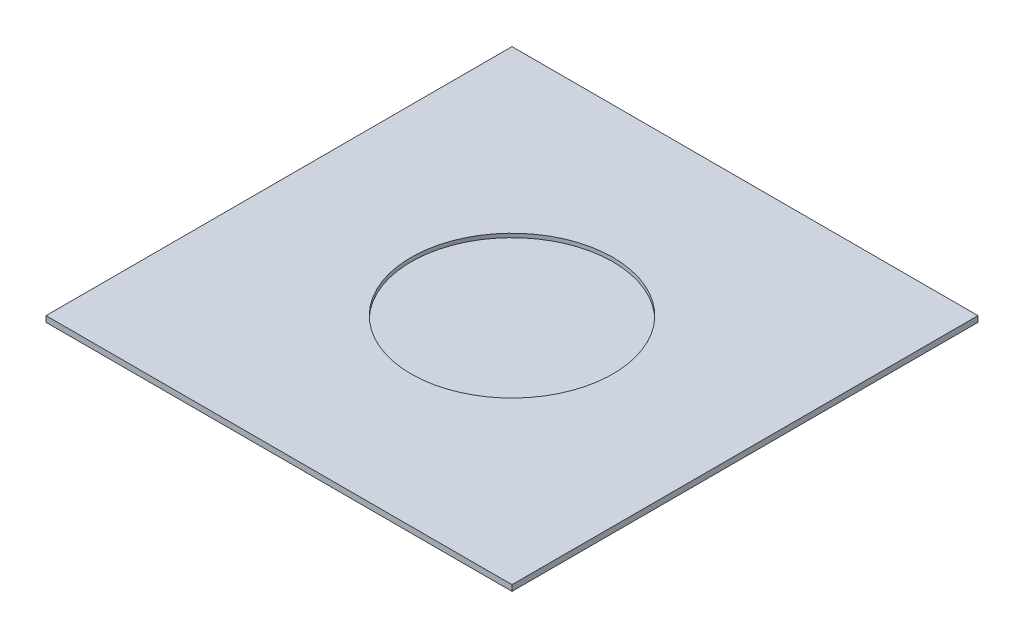
ISO-10303-21;
HEADER;
FILE_DESCRIPTION(('STEP AP214'),'2;1');
FILE_NAME('part.step','',(''),(''),'','','');
FILE_SCHEMA(('AUTOMOTIVE_DESIGN { 1 0 10303 214 1 1 1 1 }'));
ENDSEC;
DATA;
#1=APPLICATION_CONTEXT('core data for automotive mechanical design processes');
#2=APPLICATION_PROTOCOL_DEFINITION('international standard','automotive_design',2000,#1);
#3=PRODUCT_CONTEXT('',#1,'mechanical');
#4=PRODUCT('Part','Part','',(#3));
#5=PRODUCT_RELATED_PRODUCT_CATEGORY('part','',(#4));
#6=PRODUCT_DEFINITION_FORMATION('','',#4);
#7=PRODUCT_DEFINITION_CONTEXT('part definition',#1,'design');
#8=PRODUCT_DEFINITION('design','',#6,#7);
#9=PRODUCT_DEFINITION_SHAPE('','',#8);
#10=(LENGTH_UNIT() NAMED_UNIT(*) SI_UNIT(.MILLI.,.METRE.));
#11=(NAMED_UNIT(*) PLANE_ANGLE_UNIT() SI_UNIT($,.RADIAN.));
#12=(NAMED_UNIT(*) SI_UNIT($,.STERADIAN.) SOLID_ANGLE_UNIT());
#13=UNCERTAINTY_MEASURE_WITH_UNIT(LENGTH_MEASURE(1.E-05),#10,'distance_accuracy_value','');
#14=(GEOMETRIC_REPRESENTATION_CONTEXT(3) GLOBAL_UNCERTAINTY_ASSIGNED_CONTEXT((#13)) GLOBAL_UNIT_ASSIGNED_CONTEXT((#10,
#11,#12)) REPRESENTATION_CONTEXT('',''));
#15=CARTESIAN_POINT('',(0.,0.,0.));
#16=DIRECTION('',(0.,0.,1.));
#17=DIRECTION('',(1.,0.,0.));
#18=AXIS2_PLACEMENT_3D('',#15,#16,#17);
#19=CARTESIAN_POINT('',(600.,15.,-600.));
#20=DIRECTION('',(-1.,0.,0.));
#21=DIRECTION('',(0.,0.,1.));
#22=AXIS2_PLACEMENT_3D('',#19,#20,#21);
#23=PLANE('',#22);
#24=DIRECTION('',(0.,0.,-1.));
#25=VECTOR('',#24,1.);
#26=CARTESIAN_POINT('',(600.,0.,-600.));
#27=LINE('',#26,#25);
#28=CARTESIAN_POINT('',(600.,0.,600.));
#29=VERTEX_POINT('',#28);
#30=CARTESIAN_POINT('',(600.,0.,-600.));
#31=VERTEX_POINT('',#30);
#32=EDGE_CURVE('E96',#29,#31,#27,.T.);
#33=ORIENTED_EDGE('',*,*,#32,.T.);
#34=DIRECTION('',(0.,-1.,0.));
#35=VECTOR('',#34,1.);
#36=CARTESIAN_POINT('',(600.,15.,-600.));
#37=LINE('',#36,#35);
#38=CARTESIAN_POINT('',(600.,15.,-600.));
#39=VERTEX_POINT('',#38);
#40=EDGE_CURVE('E11',#39,#31,#37,.T.);
#41=ORIENTED_EDGE('',*,*,#40,.F.);
#42=DIRECTION('',(0.,0.,-1.));
#43=VECTOR('',#42,1.);
#44=CARTESIAN_POINT('',(600.,15.,-600.));
#45=LINE('',#44,#43);
#46=CARTESIAN_POINT('',(600.,15.,600.));
#47=VERTEX_POINT('',#46);
#48=EDGE_CURVE('E84',#47,#39,#45,.T.);
#49=ORIENTED_EDGE('',*,*,#48,.F.);
#50=DIRECTION('',(0.,-1.,0.));
#51=VECTOR('',#50,1.);
#52=CARTESIAN_POINT('',(600.,15.,600.));
#53=LINE('',#52,#51);
#54=EDGE_CURVE('E92',#47,#29,#53,.T.);
#55=ORIENTED_EDGE('',*,*,#54,.T.);
#56=EDGE_LOOP('',(#33,#41,#49,#55));
#57=FACE_BOUND('',#56,.T.);
#58=ADVANCED_FACE('F33',(#57),#23,.F.);
#59=CARTESIAN_POINT('',(-600.,15.,-600.));
#60=DIRECTION('',(0.,0.,1.));
#61=DIRECTION('',(1.,0.,0.));
#62=AXIS2_PLACEMENT_3D('',#59,#60,#61);
#63=PLANE('',#62);
#64=DIRECTION('',(-1.,0.,0.));
#65=VECTOR('',#64,1.);
#66=CARTESIAN_POINT('',(-600.,0.,-600.));
#67=LINE('',#66,#65);
#68=CARTESIAN_POINT('',(-600.,0.,-600.));
#69=VERTEX_POINT('',#68);
#70=EDGE_CURVE('E88',#31,#69,#67,.T.);
#71=ORIENTED_EDGE('',*,*,#70,.T.);
#72=DIRECTION('',(0.,-1.,0.));
#73=VECTOR('',#72,1.);
#74=CARTESIAN_POINT('',(-600.,15.,-600.));
#75=LINE('',#74,#73);
#76=CARTESIAN_POINT('',(-600.,15.,-600.));
#77=VERTEX_POINT('',#76);
#78=EDGE_CURVE('E41',#77,#69,#75,.T.);
#79=ORIENTED_EDGE('',*,*,#78,.F.);
#80=DIRECTION('',(-1.,0.,0.));
#81=VECTOR('',#80,1.);
#82=CARTESIAN_POINT('',(-600.,15.,-600.));
#83=LINE('',#82,#81);
#84=EDGE_CURVE('E79',#39,#77,#83,.T.);
#85=ORIENTED_EDGE('',*,*,#84,.F.);
#86=ORIENTED_EDGE('',*,*,#40,.T.);
#87=EDGE_LOOP('',(#71,#79,#85,#86));
#88=FACE_BOUND('',#87,.T.);
#89=ADVANCED_FACE('F87',(#88),#63,.F.);
#90=CARTESIAN_POINT('',(-600.,15.,-600.));
#91=DIRECTION('',(1.,0.,0.));
#92=DIRECTION('',(0.,0.,-1.));
#93=AXIS2_PLACEMENT_3D('',#90,#91,#92);
#94=PLANE('',#93);
#95=DIRECTION('',(0.,0.,1.));
#96=VECTOR('',#95,1.);
#97=CARTESIAN_POINT('',(-600.,0.,-600.));
#98=LINE('',#97,#96);
#99=CARTESIAN_POINT('',(-600.,0.,600.));
#100=VERTEX_POINT('',#99);
#101=EDGE_CURVE('E66',#69,#100,#98,.T.);
#102=ORIENTED_EDGE('',*,*,#101,.T.);
#103=DIRECTION('',(0.,-1.,0.));
#104=VECTOR('',#103,1.);
#105=CARTESIAN_POINT('',(-600.,15.,600.));
#106=LINE('',#105,#104);
#107=CARTESIAN_POINT('',(-600.,15.,600.));
#108=VERTEX_POINT('',#107);
#109=EDGE_CURVE('E89',#108,#100,#106,.T.);
#110=ORIENTED_EDGE('',*,*,#109,.F.);
#111=DIRECTION('',(0.,0.,1.));
#112=VECTOR('',#111,1.);
#113=CARTESIAN_POINT('',(-600.,15.,-600.));
#114=LINE('',#113,#112);
#115=EDGE_CURVE('E82',#77,#108,#114,.T.);
#116=ORIENTED_EDGE('',*,*,#115,.F.);
#117=ORIENTED_EDGE('',*,*,#78,.T.);
#118=EDGE_LOOP('',(#102,#110,#116,#117));
#119=FACE_BOUND('',#118,.T.);
#120=ADVANCED_FACE('F90',(#119),#94,.F.);
#121=CARTESIAN_POINT('',(-600.,15.,600.));
#122=DIRECTION('',(0.,0.,-1.));
#123=DIRECTION('',(-1.,0.,0.));
#124=AXIS2_PLACEMENT_3D('',#121,#122,#123);
#125=PLANE('',#124);
#126=DIRECTION('',(1.,0.,0.));
#127=VECTOR('',#126,1.);
#128=CARTESIAN_POINT('',(-600.,0.,600.));
#129=LINE('',#128,#127);
#130=EDGE_CURVE('E72',#100,#29,#129,.T.);
#131=ORIENTED_EDGE('',*,*,#130,.T.);
#132=ORIENTED_EDGE('',*,*,#54,.F.);
#133=DIRECTION('',(1.,0.,0.));
#134=VECTOR('',#133,1.);
#135=CARTESIAN_POINT('',(-600.,15.,600.));
#136=LINE('',#135,#134);
#137=EDGE_CURVE('E49',#108,#47,#136,.T.);
#138=ORIENTED_EDGE('',*,*,#137,.F.);
#139=ORIENTED_EDGE('',*,*,#109,.T.);
#140=EDGE_LOOP('',(#131,#132,#138,#139));
#141=FACE_BOUND('',#140,.T.);
#142=ADVANCED_FACE('F104',(#141),#125,.F.);
#143=CARTESIAN_POINT('',(0.,15.,0.));
#144=DIRECTION('',(0.,1.,0.));
#145=DIRECTION('',(0.,0.,1.));
#146=AXIS2_PLACEMENT_3D('',#143,#144,#145);
#147=PLANE('',#146);
#148=CARTESIAN_POINT('',(0.,15.,0.));
#149=DIRECTION('',(0.,1.,0.));
#150=DIRECTION('',(0.,0.,1.));
#151=AXIS2_PLACEMENT_3D('',#148,#149,#150);
#152=CIRCLE('',#151,260.);
#153=CARTESIAN_POINT('',(0.,15.,260.));
#154=VERTEX_POINT('',#153);
#155=EDGE_CURVE('E110',#154,#154,#152,.T.);
#156=ORIENTED_EDGE('',*,*,#155,.F.);
#157=EDGE_LOOP('',(#156));
#158=FACE_BOUND('',#157,.T.);
#159=ORIENTED_EDGE('',*,*,#48,.T.);
#160=ORIENTED_EDGE('',*,*,#84,.T.);
#161=ORIENTED_EDGE('',*,*,#115,.T.);
#162=ORIENTED_EDGE('',*,*,#137,.T.);
#163=EDGE_LOOP('',(#159,#160,#161,#162));
#164=FACE_BOUND('',#163,.T.);
#165=ADVANCED_FACE('F80',(#158,#164),#147,.T.);
#166=CARTESIAN_POINT('',(0.,0.,0.));
#167=DIRECTION('',(0.,1.,0.));
#168=DIRECTION('',(0.,0.,1.));
#169=AXIS2_PLACEMENT_3D('',#166,#167,#168);
#170=PLANE('',#169);
#171=ORIENTED_EDGE('',*,*,#32,.F.);
#172=ORIENTED_EDGE('',*,*,#130,.F.);
#173=ORIENTED_EDGE('',*,*,#101,.F.);
#174=ORIENTED_EDGE('',*,*,#70,.F.);
#175=EDGE_LOOP('',(#171,#172,#173,#174));
#176=FACE_BOUND('',#175,.T.);
#177=ADVANCED_FACE('F107',(#176),#170,.F.);
#178=CARTESIAN_POINT('',(0.,5.,0.));
#179=DIRECTION('',(0.,1.,0.));
#180=DIRECTION('',(0.,0.,1.));
#181=AXIS2_PLACEMENT_3D('',#178,#179,#180);
#182=CYLINDRICAL_SURFACE('',#181,260.);
#183=CARTESIAN_POINT('',(0.,5.,0.));
#184=DIRECTION('',(0.,1.,0.));
#185=DIRECTION('',(0.,0.,1.));
#186=AXIS2_PLACEMENT_3D('',#183,#184,#185);
#187=CIRCLE('',#186,260.);
#188=CARTESIAN_POINT('',(0.,5.,260.));
#189=VERTEX_POINT('',#188);
#190=EDGE_CURVE('E99',#189,#189,#187,.T.);
#191=ORIENTED_EDGE('',*,*,#190,.F.);
#192=EDGE_LOOP('',(#191));
#193=FACE_BOUND('',#192,.T.);
#194=ORIENTED_EDGE('',*,*,#155,.T.);
#195=EDGE_LOOP('',(#194));
#196=FACE_BOUND('',#195,.T.);
#197=ADVANCED_FACE('F118',(#193,#196),#182,.F.);
#198=CARTESIAN_POINT('',(0.,5.,0.));
#199=DIRECTION('',(0.,1.,0.));
#200=DIRECTION('',(0.,0.,1.));
#201=AXIS2_PLACEMENT_3D('',#198,#199,#200);
#202=PLANE('',#201);
#203=ORIENTED_EDGE('',*,*,#190,.T.);
#204=EDGE_LOOP('',(#203));
#205=FACE_BOUND('',#204,.T.);
#206=ADVANCED_FACE('F116',(#205),#202,.T.);
#207=CLOSED_SHELL('',(#58,#89,#120,#142,#165,#177,#197,#206));
#208=MANIFOLD_SOLID_BREP('B2',#207);
#209=ADVANCED_BREP_SHAPE_REPRESENTATION('',(#18,#208),#14);
#210=SHAPE_DEFINITION_REPRESENTATION(#9,#209);
ENDSEC;
END-ISO-10303-21;
